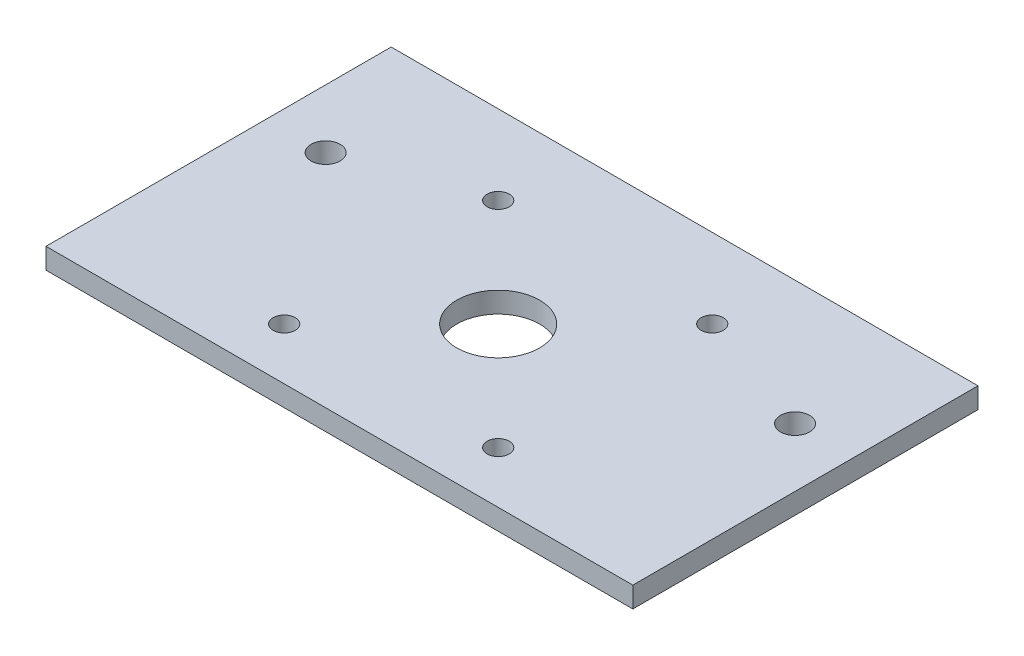
ISO-10303-21;
HEADER;
FILE_DESCRIPTION(('STEP AP214'),'2;1');
FILE_NAME('part.step','',(''),(''),'','','');
FILE_SCHEMA(('AUTOMOTIVE_DESIGN { 1 0 10303 214 1 1 1 1 }'));
ENDSEC;
DATA;
#1=APPLICATION_CONTEXT('core data for automotive mechanical design processes');
#2=APPLICATION_PROTOCOL_DEFINITION('international standard','automotive_design',2000,#1);
#3=PRODUCT_CONTEXT('',#1,'mechanical');
#4=PRODUCT('Part','Part','',(#3));
#5=PRODUCT_RELATED_PRODUCT_CATEGORY('part','',(#4));
#6=PRODUCT_DEFINITION_FORMATION('','',#4);
#7=PRODUCT_DEFINITION_CONTEXT('part definition',#1,'design');
#8=PRODUCT_DEFINITION('design','',#6,#7);
#9=PRODUCT_DEFINITION_SHAPE('','',#8);
#10=(LENGTH_UNIT() NAMED_UNIT(*) SI_UNIT(.MILLI.,.METRE.));
#11=(NAMED_UNIT(*) PLANE_ANGLE_UNIT() SI_UNIT($,.RADIAN.));
#12=(NAMED_UNIT(*) SI_UNIT($,.STERADIAN.) SOLID_ANGLE_UNIT());
#13=UNCERTAINTY_MEASURE_WITH_UNIT(LENGTH_MEASURE(1.E-05),#10,'distance_accuracy_value','');
#14=(GEOMETRIC_REPRESENTATION_CONTEXT(3) GLOBAL_UNCERTAINTY_ASSIGNED_CONTEXT((#13)) GLOBAL_UNIT_ASSIGNED_CONTEXT((#10,
#11,#12)) REPRESENTATION_CONTEXT('',''));
#15=CARTESIAN_POINT('',(0.,0.,0.));
#16=DIRECTION('',(0.,0.,1.));
#17=DIRECTION('',(1.,0.,0.));
#18=AXIS2_PLACEMENT_3D('',#15,#16,#17);
#19=CARTESIAN_POINT('',(-65.,3.,-45.));
#20=DIRECTION('',(0.,0.,1.));
#21=DIRECTION('',(1.,0.,0.));
#22=AXIS2_PLACEMENT_3D('',#19,#20,#21);
#23=PLANE('',#22);
#24=DIRECTION('',(0.,1.,0.));
#25=VECTOR('',#24,1.);
#26=CARTESIAN_POINT('',(-42.5,-7.,-45.));
#27=LINE('',#26,#25);
#28=CARTESIAN_POINT('',(-42.5,0.,-45.));
#29=VERTEX_POINT('',#28);
#30=CARTESIAN_POINT('',(-42.5,3.,-45.));
#31=VERTEX_POINT('',#30);
#32=EDGE_CURVE('E65',#29,#31,#27,.T.);
#33=ORIENTED_EDGE('',*,*,#32,.T.);
#34=DIRECTION('',(-1.,0.,0.));
#35=VECTOR('',#34,1.);
#36=CARTESIAN_POINT('',(-65.,3.,-45.));
#37=LINE('',#36,#35);
#38=CARTESIAN_POINT('',(42.5,3.,-45.));
#39=VERTEX_POINT('',#38);
#40=EDGE_CURVE('E144',#39,#31,#37,.T.);
#41=ORIENTED_EDGE('',*,*,#40,.F.);
#42=DIRECTION('',(0.,1.,0.));
#43=VECTOR('',#42,1.);
#44=CARTESIAN_POINT('',(42.5,-7.,-45.));
#45=LINE('',#44,#43);
#46=CARTESIAN_POINT('',(42.5,0.,-45.));
#47=VERTEX_POINT('',#46);
#48=EDGE_CURVE('E92',#47,#39,#45,.T.);
#49=ORIENTED_EDGE('',*,*,#48,.F.);
#50=DIRECTION('',(-1.,0.,0.));
#51=VECTOR('',#50,1.);
#52=CARTESIAN_POINT('',(-65.,0.,-45.));
#53=LINE('',#52,#51);
#54=EDGE_CURVE('E146',#47,#29,#53,.T.);
#55=ORIENTED_EDGE('',*,*,#54,.T.);
#56=EDGE_LOOP('',(#33,#41,#49,#55));
#57=FACE_BOUND('',#56,.T.);
#58=ADVANCED_FACE('F45',(#57),#23,.F.);
#59=CARTESIAN_POINT('',(0.,3.,0.));
#60=DIRECTION('',(0.,1.,0.));
#61=DIRECTION('',(0.,0.,1.));
#62=AXIS2_PLACEMENT_3D('',#59,#60,#61);
#63=PLANE('',#62);
#64=CARTESIAN_POINT('',(0.,3.,-18.));
#65=DIRECTION('',(0.,1.,0.));
#66=DIRECTION('',(0.,0.,1.));
#67=AXIS2_PLACEMENT_3D('',#64,#65,#66);
#68=CIRCLE('',#67,6.);
#69=CARTESIAN_POINT('',(0.,3.,-12.));
#70=VERTEX_POINT('',#69);
#71=EDGE_CURVE('E113',#70,#70,#68,.T.);
#72=ORIENTED_EDGE('',*,*,#71,.F.);
#73=EDGE_LOOP('',(#72));
#74=FACE_BOUND('',#73,.T.);
#75=CARTESIAN_POINT('',(34.,3.,-26.9999999999999));
#76=DIRECTION('',(0.,1.,0.));
#77=DIRECTION('',(0.,0.,1.));
#78=AXIS2_PLACEMENT_3D('',#75,#76,#77);
#79=CIRCLE('',#78,2.1);
#80=CARTESIAN_POINT('',(34.,3.,-24.8999999999999));
#81=VERTEX_POINT('',#80);
#82=EDGE_CURVE('E119',#81,#81,#79,.T.);
#83=ORIENTED_EDGE('',*,*,#82,.F.);
#84=EDGE_LOOP('',(#83));
#85=FACE_BOUND('',#84,.T.);
#86=CARTESIAN_POINT('',(-34.,3.,-26.9999999999999));
#87=DIRECTION('',(0.,1.,0.));
#88=DIRECTION('',(0.,0.,1.));
#89=AXIS2_PLACEMENT_3D('',#86,#87,#88);
#90=CIRCLE('',#89,2.1);
#91=CARTESIAN_POINT('',(-34.,3.,-24.8999999999999));
#92=VERTEX_POINT('',#91);
#93=EDGE_CURVE('E125',#92,#92,#90,.T.);
#94=ORIENTED_EDGE('',*,*,#93,.F.);
#95=EDGE_LOOP('',(#94));
#96=FACE_BOUND('',#95,.T.);
#97=CARTESIAN_POINT('',(15.5,3.,-33.5));
#98=DIRECTION('',(0.,1.,0.));
#99=DIRECTION('',(0.,0.,1.));
#100=AXIS2_PLACEMENT_3D('',#97,#98,#99);
#101=CIRCLE('',#100,1.6);
#102=CARTESIAN_POINT('',(15.5,3.,-31.9));
#103=VERTEX_POINT('',#102);
#104=EDGE_CURVE('E128',#103,#103,#101,.T.);
#105=ORIENTED_EDGE('',*,*,#104,.F.);
#106=EDGE_LOOP('',(#105));
#107=FACE_BOUND('',#106,.T.);
#108=CARTESIAN_POINT('',(-15.5,3.,-33.5));
#109=DIRECTION('',(0.,1.,0.));
#110=DIRECTION('',(0.,0.,1.));
#111=AXIS2_PLACEMENT_3D('',#108,#109,#110);
#112=CIRCLE('',#111,1.6);
#113=CARTESIAN_POINT('',(-15.5,3.,-31.9));
#114=VERTEX_POINT('',#113);
#115=EDGE_CURVE('E132',#114,#114,#112,.T.);
#116=ORIENTED_EDGE('',*,*,#115,.F.);
#117=EDGE_LOOP('',(#116));
#118=FACE_BOUND('',#117,.T.);
#119=CARTESIAN_POINT('',(-15.5,3.,-2.49999999999999));
#120=DIRECTION('',(0.,1.,0.));
#121=DIRECTION('',(0.,0.,1.));
#122=AXIS2_PLACEMENT_3D('',#119,#120,#121);
#123=CIRCLE('',#122,1.6);
#124=CARTESIAN_POINT('',(-15.5,3.,-0.899999999999992));
#125=VERTEX_POINT('',#124);
#126=EDGE_CURVE('E136',#125,#125,#123,.T.);
#127=ORIENTED_EDGE('',*,*,#126,.F.);
#128=EDGE_LOOP('',(#127));
#129=FACE_BOUND('',#128,.T.);
#130=CARTESIAN_POINT('',(15.5,3.,-2.5));
#131=DIRECTION('',(0.,1.,0.));
#132=DIRECTION('',(0.,0.,1.));
#133=AXIS2_PLACEMENT_3D('',#130,#131,#132);
#134=CIRCLE('',#133,1.6);
#135=CARTESIAN_POINT('',(15.5,3.,-0.899999999999996));
#136=VERTEX_POINT('',#135);
#137=EDGE_CURVE('E140',#136,#136,#134,.T.);
#138=ORIENTED_EDGE('',*,*,#137,.F.);
#139=EDGE_LOOP('',(#138));
#140=FACE_BOUND('',#139,.T.);
#141=ORIENTED_EDGE('',*,*,#40,.T.);
#142=DIRECTION('',(0.,0.,1.));
#143=VECTOR('',#142,1.);
#144=CARTESIAN_POINT('',(-42.5,3.,-45.));
#145=LINE('',#144,#143);
#146=CARTESIAN_POINT('',(-42.5,3.,5.));
#147=VERTEX_POINT('',#146);
#148=EDGE_CURVE('E103',#31,#147,#145,.T.);
#149=ORIENTED_EDGE('',*,*,#148,.T.);
#150=DIRECTION('',(1.,0.,0.));
#151=VECTOR('',#150,1.);
#152=CARTESIAN_POINT('',(-42.5,3.,5.));
#153=LINE('',#152,#151);
#154=CARTESIAN_POINT('',(42.5,3.,5.));
#155=VERTEX_POINT('',#154);
#156=EDGE_CURVE('E86',#147,#155,#153,.T.);
#157=ORIENTED_EDGE('',*,*,#156,.T.);
#158=DIRECTION('',(0.,0.,-1.));
#159=VECTOR('',#158,1.);
#160=CARTESIAN_POINT('',(42.5,3.,-45.));
#161=LINE('',#160,#159);
#162=EDGE_CURVE('E95',#155,#39,#161,.T.);
#163=ORIENTED_EDGE('',*,*,#162,.T.);
#164=EDGE_LOOP('',(#141,#149,#157,#163));
#165=FACE_BOUND('',#164,.T.);
#166=ADVANCED_FACE('F102',(#74,#85,#96,#107,#118,#129,#140,#165),#63,.T.);
#167=CARTESIAN_POINT('',(0.,0.,0.));
#168=DIRECTION('',(0.,1.,0.));
#169=DIRECTION('',(0.,0.,1.));
#170=AXIS2_PLACEMENT_3D('',#167,#168,#169);
#171=PLANE('',#170);
#172=CARTESIAN_POINT('',(15.5,0.,-2.5));
#173=DIRECTION('',(0.,1.,0.));
#174=DIRECTION('',(0.,0.,1.));
#175=AXIS2_PLACEMENT_3D('',#172,#173,#174);
#176=CIRCLE('',#175,1.6);
#177=CARTESIAN_POINT('',(15.5,0.,-0.899999999999996));
#178=VERTEX_POINT('',#177);
#179=EDGE_CURVE('E143',#178,#178,#176,.T.);
#180=ORIENTED_EDGE('',*,*,#179,.T.);
#181=EDGE_LOOP('',(#180));
#182=FACE_BOUND('',#181,.T.);
#183=CARTESIAN_POINT('',(-15.5,0.,-2.49999999999999));
#184=DIRECTION('',(0.,1.,0.));
#185=DIRECTION('',(0.,0.,1.));
#186=AXIS2_PLACEMENT_3D('',#183,#184,#185);
#187=CIRCLE('',#186,1.6);
#188=CARTESIAN_POINT('',(-15.5,0.,-0.899999999999992));
#189=VERTEX_POINT('',#188);
#190=EDGE_CURVE('E139',#189,#189,#187,.T.);
#191=ORIENTED_EDGE('',*,*,#190,.T.);
#192=EDGE_LOOP('',(#191));
#193=FACE_BOUND('',#192,.T.);
#194=CARTESIAN_POINT('',(-15.5,0.,-33.5));
#195=DIRECTION('',(0.,1.,0.));
#196=DIRECTION('',(0.,0.,1.));
#197=AXIS2_PLACEMENT_3D('',#194,#195,#196);
#198=CIRCLE('',#197,1.6);
#199=CARTESIAN_POINT('',(-15.5,0.,-31.9));
#200=VERTEX_POINT('',#199);
#201=EDGE_CURVE('E135',#200,#200,#198,.T.);
#202=ORIENTED_EDGE('',*,*,#201,.T.);
#203=EDGE_LOOP('',(#202));
#204=FACE_BOUND('',#203,.T.);
#205=CARTESIAN_POINT('',(15.5,0.,-33.5));
#206=DIRECTION('',(0.,1.,0.));
#207=DIRECTION('',(0.,0.,1.));
#208=AXIS2_PLACEMENT_3D('',#205,#206,#207);
#209=CIRCLE('',#208,1.6);
#210=CARTESIAN_POINT('',(15.5,0.,-31.9));
#211=VERTEX_POINT('',#210);
#212=EDGE_CURVE('E131',#211,#211,#209,.T.);
#213=ORIENTED_EDGE('',*,*,#212,.T.);
#214=EDGE_LOOP('',(#213));
#215=FACE_BOUND('',#214,.T.);
#216=CARTESIAN_POINT('',(-34.,0.,-26.9999999999999));
#217=DIRECTION('',(0.,-1.,0.));
#218=DIRECTION('',(0.,0.,-1.));
#219=AXIS2_PLACEMENT_3D('',#216,#217,#218);
#220=CIRCLE('',#219,2.1);
#221=CARTESIAN_POINT('',(-34.,0.,-29.0999999999999));
#222=VERTEX_POINT('',#221);
#223=EDGE_CURVE('E122',#222,#222,#220,.T.);
#224=ORIENTED_EDGE('',*,*,#223,.F.);
#225=EDGE_LOOP('',(#224));
#226=FACE_BOUND('',#225,.T.);
#227=CARTESIAN_POINT('',(34.,0.,-26.9999999999999));
#228=DIRECTION('',(0.,-1.,0.));
#229=DIRECTION('',(0.,0.,-1.));
#230=AXIS2_PLACEMENT_3D('',#227,#228,#229);
#231=CIRCLE('',#230,2.1);
#232=CARTESIAN_POINT('',(34.,0.,-29.0999999999999));
#233=VERTEX_POINT('',#232);
#234=EDGE_CURVE('E116',#233,#233,#231,.T.);
#235=ORIENTED_EDGE('',*,*,#234,.F.);
#236=EDGE_LOOP('',(#235));
#237=FACE_BOUND('',#236,.T.);
#238=CARTESIAN_POINT('',(0.,0.,-18.));
#239=DIRECTION('',(0.,-1.,0.));
#240=DIRECTION('',(0.,0.,-1.));
#241=AXIS2_PLACEMENT_3D('',#238,#239,#240);
#242=CIRCLE('',#241,6.);
#243=CARTESIAN_POINT('',(0.,0.,-24.));
#244=VERTEX_POINT('',#243);
#245=EDGE_CURVE('E108',#244,#244,#242,.T.);
#246=ORIENTED_EDGE('',*,*,#245,.F.);
#247=EDGE_LOOP('',(#246));
#248=FACE_BOUND('',#247,.T.);
#249=DIRECTION('',(0.,0.,1.));
#250=VECTOR('',#249,1.);
#251=CARTESIAN_POINT('',(-42.5,0.,0.));
#252=LINE('',#251,#250);
#253=CARTESIAN_POINT('',(-42.5,0.,5.));
#254=VERTEX_POINT('',#253);
#255=EDGE_CURVE('E13',#29,#254,#252,.T.);
#256=ORIENTED_EDGE('',*,*,#255,.F.);
#257=ORIENTED_EDGE('',*,*,#54,.F.);
#258=DIRECTION('',(0.,0.,-1.));
#259=VECTOR('',#258,1.);
#260=CARTESIAN_POINT('',(42.5,0.,0.));
#261=LINE('',#260,#259);
#262=CARTESIAN_POINT('',(42.5,0.,5.));
#263=VERTEX_POINT('',#262);
#264=EDGE_CURVE('E52',#263,#47,#261,.T.);
#265=ORIENTED_EDGE('',*,*,#264,.F.);
#266=DIRECTION('',(1.,0.,0.));
#267=VECTOR('',#266,1.);
#268=CARTESIAN_POINT('',(0.,0.,5.));
#269=LINE('',#268,#267);
#270=EDGE_CURVE('E89',#254,#263,#269,.T.);
#271=ORIENTED_EDGE('',*,*,#270,.F.);
#272=EDGE_LOOP('',(#256,#257,#265,#271));
#273=FACE_BOUND('',#272,.T.);
#274=ADVANCED_FACE('F160',(#182,#193,#204,#215,#226,#237,#248,#273),#171,.F.);
#275=CARTESIAN_POINT('',(15.5,-7.,-2.5));
#276=DIRECTION('',(0.,1.,0.));
#277=DIRECTION('',(0.,0.,1.));
#278=AXIS2_PLACEMENT_3D('',#275,#276,#277);
#279=CYLINDRICAL_SURFACE('',#278,1.6);
#280=ORIENTED_EDGE('',*,*,#137,.T.);
#281=EDGE_LOOP('',(#280));
#282=FACE_BOUND('',#281,.T.);
#283=ORIENTED_EDGE('',*,*,#179,.F.);
#284=EDGE_LOOP('',(#283));
#285=FACE_BOUND('',#284,.T.);
#286=ADVANCED_FACE('F183',(#282,#285),#279,.F.);
#287=CARTESIAN_POINT('',(-15.5,-7.,-2.49999999999999));
#288=DIRECTION('',(0.,1.,0.));
#289=DIRECTION('',(0.,0.,1.));
#290=AXIS2_PLACEMENT_3D('',#287,#288,#289);
#291=CYLINDRICAL_SURFACE('',#290,1.6);
#292=ORIENTED_EDGE('',*,*,#126,.T.);
#293=EDGE_LOOP('',(#292));
#294=FACE_BOUND('',#293,.T.);
#295=ORIENTED_EDGE('',*,*,#190,.F.);
#296=EDGE_LOOP('',(#295));
#297=FACE_BOUND('',#296,.T.);
#298=ADVANCED_FACE('F190',(#294,#297),#291,.F.);
#299=CARTESIAN_POINT('',(-15.5,-7.,-33.5));
#300=DIRECTION('',(0.,1.,0.));
#301=DIRECTION('',(0.,0.,1.));
#302=AXIS2_PLACEMENT_3D('',#299,#300,#301);
#303=CYLINDRICAL_SURFACE('',#302,1.6);
#304=ORIENTED_EDGE('',*,*,#115,.T.);
#305=EDGE_LOOP('',(#304));
#306=FACE_BOUND('',#305,.T.);
#307=ORIENTED_EDGE('',*,*,#201,.F.);
#308=EDGE_LOOP('',(#307));
#309=FACE_BOUND('',#308,.T.);
#310=ADVANCED_FACE('F194',(#306,#309),#303,.F.);
#311=CARTESIAN_POINT('',(15.5,-7.,-33.5));
#312=DIRECTION('',(0.,1.,0.));
#313=DIRECTION('',(0.,0.,1.));
#314=AXIS2_PLACEMENT_3D('',#311,#312,#313);
#315=CYLINDRICAL_SURFACE('',#314,1.6);
#316=ORIENTED_EDGE('',*,*,#104,.T.);
#317=EDGE_LOOP('',(#316));
#318=FACE_BOUND('',#317,.T.);
#319=ORIENTED_EDGE('',*,*,#212,.F.);
#320=EDGE_LOOP('',(#319));
#321=FACE_BOUND('',#320,.T.);
#322=ADVANCED_FACE('F198',(#318,#321),#315,.F.);
#323=CARTESIAN_POINT('',(-34.,10.,-26.9999999999999));
#324=DIRECTION('',(0.,-1.,0.));
#325=DIRECTION('',(0.,0.,-1.));
#326=AXIS2_PLACEMENT_3D('',#323,#324,#325);
#327=CYLINDRICAL_SURFACE('',#326,2.1);
#328=ORIENTED_EDGE('',*,*,#93,.T.);
#329=EDGE_LOOP('',(#328));
#330=FACE_BOUND('',#329,.T.);
#331=ORIENTED_EDGE('',*,*,#223,.T.);
#332=EDGE_LOOP('',(#331));
#333=FACE_BOUND('',#332,.T.);
#334=ADVANCED_FACE('F202',(#330,#333),#327,.F.);
#335=CARTESIAN_POINT('',(34.,10.,-26.9999999999999));
#336=DIRECTION('',(0.,-1.,0.));
#337=DIRECTION('',(0.,0.,-1.));
#338=AXIS2_PLACEMENT_3D('',#335,#336,#337);
#339=CYLINDRICAL_SURFACE('',#338,2.1);
#340=ORIENTED_EDGE('',*,*,#82,.T.);
#341=EDGE_LOOP('',(#340));
#342=FACE_BOUND('',#341,.T.);
#343=ORIENTED_EDGE('',*,*,#234,.T.);
#344=EDGE_LOOP('',(#343));
#345=FACE_BOUND('',#344,.T.);
#346=ADVANCED_FACE('F170',(#342,#345),#339,.F.);
#347=CARTESIAN_POINT('',(0.,10.,-18.));
#348=DIRECTION('',(0.,-1.,0.));
#349=DIRECTION('',(0.,0.,-1.));
#350=AXIS2_PLACEMENT_3D('',#347,#348,#349);
#351=CYLINDRICAL_SURFACE('',#350,6.);
#352=ORIENTED_EDGE('',*,*,#71,.T.);
#353=EDGE_LOOP('',(#352));
#354=FACE_BOUND('',#353,.T.);
#355=ORIENTED_EDGE('',*,*,#245,.T.);
#356=EDGE_LOOP('',(#355));
#357=FACE_BOUND('',#356,.T.);
#358=ADVANCED_FACE('F163',(#354,#357),#351,.F.);
#359=CARTESIAN_POINT('',(-42.5,-7.,-45.));
#360=DIRECTION('',(-1.,0.,0.));
#361=DIRECTION('',(0.,0.,1.));
#362=AXIS2_PLACEMENT_3D('',#359,#360,#361);
#363=PLANE('',#362);
#364=ORIENTED_EDGE('',*,*,#255,.T.);
#365=DIRECTION('',(0.,1.,0.));
#366=VECTOR('',#365,1.);
#367=CARTESIAN_POINT('',(-42.5,-7.,5.));
#368=LINE('',#367,#366);
#369=EDGE_CURVE('E59',#254,#147,#368,.T.);
#370=ORIENTED_EDGE('',*,*,#369,.T.);
#371=ORIENTED_EDGE('',*,*,#148,.F.);
#372=ORIENTED_EDGE('',*,*,#32,.F.);
#373=EDGE_LOOP('',(#364,#370,#371,#372));
#374=FACE_BOUND('',#373,.T.);
#375=ADVANCED_FACE('F161',(#374),#363,.T.);
#376=CARTESIAN_POINT('',(42.5,-7.,-45.));
#377=DIRECTION('',(1.,0.,0.));
#378=DIRECTION('',(0.,0.,-1.));
#379=AXIS2_PLACEMENT_3D('',#376,#377,#378);
#380=PLANE('',#379);
#381=ORIENTED_EDGE('',*,*,#264,.T.);
#382=ORIENTED_EDGE('',*,*,#48,.T.);
#383=ORIENTED_EDGE('',*,*,#162,.F.);
#384=DIRECTION('',(0.,1.,0.));
#385=VECTOR('',#384,1.);
#386=CARTESIAN_POINT('',(42.5,-7.,5.));
#387=LINE('',#386,#385);
#388=EDGE_CURVE('E82',#263,#155,#387,.T.);
#389=ORIENTED_EDGE('',*,*,#388,.F.);
#390=EDGE_LOOP('',(#381,#382,#383,#389));
#391=FACE_BOUND('',#390,.T.);
#392=ADVANCED_FACE('F96',(#391),#380,.T.);
#393=CARTESIAN_POINT('',(-42.5,-7.,5.));
#394=DIRECTION('',(0.,0.,1.));
#395=DIRECTION('',(1.,0.,0.));
#396=AXIS2_PLACEMENT_3D('',#393,#394,#395);
#397=PLANE('',#396);
#398=ORIENTED_EDGE('',*,*,#270,.T.);
#399=ORIENTED_EDGE('',*,*,#388,.T.);
#400=ORIENTED_EDGE('',*,*,#156,.F.);
#401=ORIENTED_EDGE('',*,*,#369,.F.);
#402=EDGE_LOOP('',(#398,#399,#400,#401));
#403=FACE_BOUND('',#402,.T.);
#404=ADVANCED_FACE('F84',(#403),#397,.T.);
#405=CLOSED_SHELL('',(#58,#166,#274,#286,#298,#310,#322,#334,#346,#358,#375,#392,#404));
#406=MANIFOLD_SOLID_BREP('B2',#405);
#407=ADVANCED_BREP_SHAPE_REPRESENTATION('',(#18,#406),#14);
#408=SHAPE_DEFINITION_REPRESENTATION(#9,#407);
ENDSEC;
END-ISO-10303-21;
